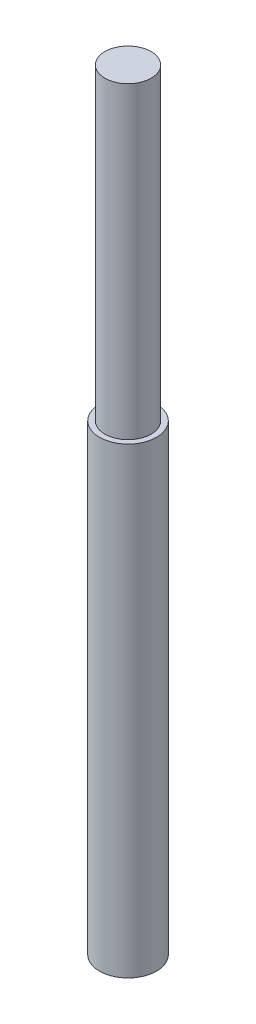
ISO-10303-21;
HEADER;
FILE_DESCRIPTION(('STEP AP214'),'2;1');
FILE_NAME('part.step','',(''),(''),'','','');
FILE_SCHEMA(('AUTOMOTIVE_DESIGN { 1 0 10303 214 1 1 1 1 }'));
ENDSEC;
DATA;
#1=APPLICATION_CONTEXT('core data for automotive mechanical design processes');
#2=APPLICATION_PROTOCOL_DEFINITION('international standard','automotive_design',2000,#1);
#3=PRODUCT_CONTEXT('',#1,'mechanical');
#4=PRODUCT('Part','Part','',(#3));
#5=PRODUCT_RELATED_PRODUCT_CATEGORY('part','',(#4));
#6=PRODUCT_DEFINITION_FORMATION('','',#4);
#7=PRODUCT_DEFINITION_CONTEXT('part definition',#1,'design');
#8=PRODUCT_DEFINITION('design','',#6,#7);
#9=PRODUCT_DEFINITION_SHAPE('','',#8);
#10=(LENGTH_UNIT() NAMED_UNIT(*) SI_UNIT(.MILLI.,.METRE.));
#11=(NAMED_UNIT(*) PLANE_ANGLE_UNIT() SI_UNIT($,.RADIAN.));
#12=(NAMED_UNIT(*) SI_UNIT($,.STERADIAN.) SOLID_ANGLE_UNIT());
#13=UNCERTAINTY_MEASURE_WITH_UNIT(LENGTH_MEASURE(1.E-05),#10,'distance_accuracy_value','');
#14=(GEOMETRIC_REPRESENTATION_CONTEXT(3) GLOBAL_UNCERTAINTY_ASSIGNED_CONTEXT((#13)) GLOBAL_UNIT_ASSIGNED_CONTEXT((#10,
#11,#12)) REPRESENTATION_CONTEXT('',''));
#15=CARTESIAN_POINT('',(0.,0.,0.));
#16=DIRECTION('',(0.,0.,1.));
#17=DIRECTION('',(1.,0.,0.));
#18=AXIS2_PLACEMENT_3D('',#15,#16,#17);
#19=CARTESIAN_POINT('',(0.,27.10745624453,0.));
#20=DIRECTION('',(0.,-1.,0.));
#21=DIRECTION('',(-1.,0.,0.));
#22=AXIS2_PLACEMENT_3D('',#19,#20,#21);
#23=CONICAL_SURFACE('',#22,0.6533025181546,1.02974425867665);
#24=DIRECTION('',(0.857167300702112,-0.515038074910054,0.));
#25=VECTOR('',#24,1.);
#26=CARTESIAN_POINT('',(0.6533025181546,27.10745624453,0.));
#27=LINE('',#26,#25);
#28=CARTESIAN_POINT('',(0.,27.5,0.));
#29=VERTEX_POINT('',#28);
#30=CARTESIAN_POINT('',(1.25,26.74892422622,0.));
#31=VERTEX_POINT('',#30);
#32=EDGE_CURVE('E11',#29,#31,#27,.T.);
#33=ORIENTED_EDGE('',*,*,#32,.T.);
#34=CARTESIAN_POINT('',(0.,26.74892422622,0.));
#35=DIRECTION('',(0.,-1.,0.));
#36=DIRECTION('',(-1.,0.,0.));
#37=AXIS2_PLACEMENT_3D('',#34,#35,#36);
#38=CIRCLE('',#37,1.25);
#39=EDGE_CURVE('E72',#31,#31,#38,.T.);
#40=ORIENTED_EDGE('',*,*,#39,.T.);
#41=ORIENTED_EDGE('',*,*,#32,.F.);
#42=EDGE_LOOP('',(#33,#40,#41));
#43=FACE_BOUND('',#42,.T.);
#44=ADVANCED_FACE('F17',(#43),#23,.F.);
#45=CARTESIAN_POINT('',(0.,28.875,0.));
#46=DIRECTION('',(0.,-1.,0.));
#47=DIRECTION('',(-1.,0.,0.));
#48=AXIS2_PLACEMENT_3D('',#45,#46,#47);
#49=CYLINDRICAL_SURFACE('',#48,1.25);
#50=ORIENTED_EDGE('',*,*,#39,.F.);
#51=DIRECTION('',(0.,-1.,0.));
#52=VECTOR('',#51,1.);
#53=CARTESIAN_POINT('',(1.25,28.875,0.));
#54=LINE('',#53,#52);
#55=CARTESIAN_POINT('',(1.25,0.,0.));
#56=VERTEX_POINT('',#55);
#57=EDGE_CURVE('E28',#31,#56,#54,.T.);
#58=ORIENTED_EDGE('',*,*,#57,.T.);
#59=CARTESIAN_POINT('',(0.,0.,0.));
#60=DIRECTION('',(0.,-1.,0.));
#61=DIRECTION('',(-1.,0.,0.));
#62=AXIS2_PLACEMENT_3D('',#59,#60,#61);
#63=CIRCLE('',#62,1.25);
#64=EDGE_CURVE('E62',#56,#56,#63,.T.);
#65=ORIENTED_EDGE('',*,*,#64,.T.);
#66=ORIENTED_EDGE('',*,*,#57,.F.);
#67=EDGE_LOOP('',(#50,#58,#65,#66));
#68=FACE_BOUND('',#67,.T.);
#69=ADVANCED_FACE('F115',(#68),#49,.F.);
#70=CARTESIAN_POINT('',(0.,50.,0.));
#71=DIRECTION('',(0.,-1.,0.));
#72=DIRECTION('',(0.,0.,-1.));
#73=AXIS2_PLACEMENT_3D('',#70,#71,#72);
#74=PLANE('',#73);
#75=CARTESIAN_POINT('',(0.,50.,0.));
#76=DIRECTION('',(0.,-1.,0.));
#77=DIRECTION('',(1.,0.,0.));
#78=AXIS2_PLACEMENT_3D('',#75,#76,#77);
#79=CIRCLE('',#78,1.5);
#80=CARTESIAN_POINT('',(1.5,50.,0.));
#81=VERTEX_POINT('',#80);
#82=EDGE_CURVE('E75',#81,#81,#79,.T.);
#83=ORIENTED_EDGE('',*,*,#82,.F.);
#84=EDGE_LOOP('',(#83));
#85=FACE_BOUND('',#84,.T.);
#86=ADVANCED_FACE('F120',(#85),#74,.F.);
#87=CARTESIAN_POINT('',(0.,52.5,0.));
#88=DIRECTION('',(0.,-1.,0.));
#89=DIRECTION('',(-1.,0.,0.));
#90=AXIS2_PLACEMENT_3D('',#87,#88,#89);
#91=CYLINDRICAL_SURFACE('',#90,1.5);
#92=CARTESIAN_POINT('',(0.,30.,0.));
#93=DIRECTION('',(0.,1.,0.));
#94=DIRECTION('',(1.,0.,0.));
#95=AXIS2_PLACEMENT_3D('',#92,#93,#94);
#96=CIRCLE('',#95,1.5);
#97=CARTESIAN_POINT('',(1.5,30.,0.));
#98=VERTEX_POINT('',#97);
#99=EDGE_CURVE('E68',#98,#98,#96,.T.);
#100=ORIENTED_EDGE('',*,*,#99,.T.);
#101=DIRECTION('',(0.,1.,0.));
#102=VECTOR('',#101,1.);
#103=CARTESIAN_POINT('',(1.5,52.5,0.));
#104=LINE('',#103,#102);
#105=EDGE_CURVE('E81',#98,#81,#104,.T.);
#106=ORIENTED_EDGE('',*,*,#105,.T.);
#107=ORIENTED_EDGE('',*,*,#82,.T.);
#108=ORIENTED_EDGE('',*,*,#105,.F.);
#109=EDGE_LOOP('',(#100,#106,#107,#108));
#110=FACE_BOUND('',#109,.T.);
#111=ADVANCED_FACE('F93',(#110),#91,.T.);
#112=CARTESIAN_POINT('',(0.,30.,0.));
#113=DIRECTION('',(0.,-1.,0.));
#114=DIRECTION('',(0.,0.,-1.));
#115=AXIS2_PLACEMENT_3D('',#112,#113,#114);
#116=PLANE('',#115);
#117=ORIENTED_EDGE('',*,*,#99,.F.);
#118=EDGE_LOOP('',(#117));
#119=FACE_BOUND('',#118,.T.);
#120=CARTESIAN_POINT('',(0.,30.,0.));
#121=DIRECTION('',(0.,-1.,0.));
#122=DIRECTION('',(1.,0.,0.));
#123=AXIS2_PLACEMENT_3D('',#120,#121,#122);
#124=CIRCLE('',#123,1.85);
#125=CARTESIAN_POINT('',(1.85,30.,0.));
#126=VERTEX_POINT('',#125);
#127=EDGE_CURVE('E21',#126,#126,#124,.T.);
#128=ORIENTED_EDGE('',*,*,#127,.F.);
#129=EDGE_LOOP('',(#128));
#130=FACE_BOUND('',#129,.T.);
#131=ADVANCED_FACE('F137',(#119,#130),#116,.F.);
#132=CARTESIAN_POINT('',(0.,52.5,0.));
#133=DIRECTION('',(0.,-1.,0.));
#134=DIRECTION('',(-1.,0.,0.));
#135=AXIS2_PLACEMENT_3D('',#132,#133,#134);
#136=CYLINDRICAL_SURFACE('',#135,1.85);
#137=CARTESIAN_POINT('',(0.,0.,0.));
#138=DIRECTION('',(0.,1.,0.));
#139=DIRECTION('',(1.,0.,0.));
#140=AXIS2_PLACEMENT_3D('',#137,#138,#139);
#141=CIRCLE('',#140,1.85);
#142=CARTESIAN_POINT('',(1.85,0.,0.));
#143=VERTEX_POINT('',#142);
#144=EDGE_CURVE('E59',#143,#143,#141,.T.);
#145=ORIENTED_EDGE('',*,*,#144,.T.);
#146=DIRECTION('',(0.,1.,0.));
#147=VECTOR('',#146,1.);
#148=CARTESIAN_POINT('',(1.85,52.5,0.));
#149=LINE('',#148,#147);
#150=EDGE_CURVE('E56',#143,#126,#149,.T.);
#151=ORIENTED_EDGE('',*,*,#150,.T.);
#152=ORIENTED_EDGE('',*,*,#127,.T.);
#153=ORIENTED_EDGE('',*,*,#150,.F.);
#154=EDGE_LOOP('',(#145,#151,#152,#153));
#155=FACE_BOUND('',#154,.T.);
#156=ADVANCED_FACE('F57',(#155),#136,.T.);
#157=CARTESIAN_POINT('',(0.,0.,0.));
#158=DIRECTION('',(0.,-1.,0.));
#159=DIRECTION('',(0.,0.,-1.));
#160=AXIS2_PLACEMENT_3D('',#157,#158,#159);
#161=PLANE('',#160);
#162=ORIENTED_EDGE('',*,*,#64,.F.);
#163=EDGE_LOOP('',(#162));
#164=FACE_BOUND('',#163,.T.);
#165=ORIENTED_EDGE('',*,*,#144,.F.);
#166=EDGE_LOOP('',(#165));
#167=FACE_BOUND('',#166,.T.);
#168=ADVANCED_FACE('F19',(#164,#167),#161,.T.);
#169=CLOSED_SHELL('',(#44,#69,#86,#111,#131,#156,#168));
#170=MANIFOLD_SOLID_BREP('B1',#169);
#171=ADVANCED_BREP_SHAPE_REPRESENTATION('',(#18,#170),#14);
#172=SHAPE_DEFINITION_REPRESENTATION(#9,#171);
ENDSEC;
END-ISO-10303-21;
